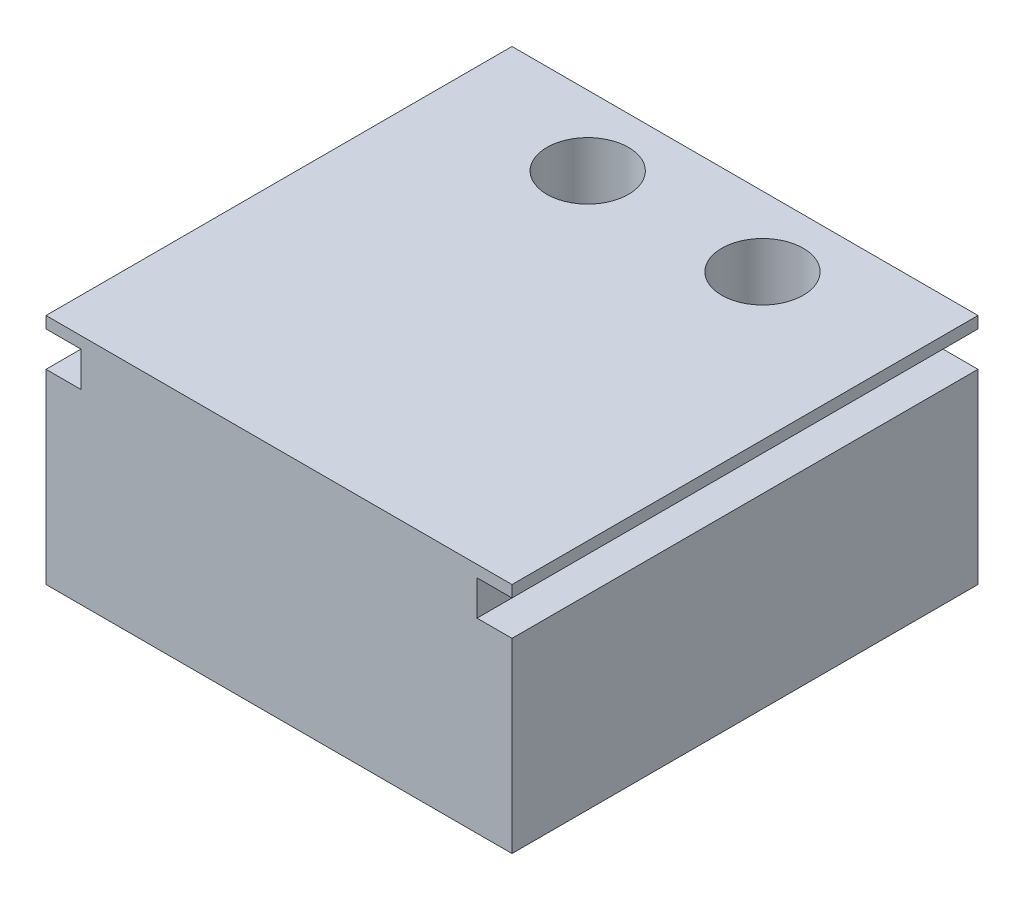
ISO-10303-21;
HEADER;
FILE_DESCRIPTION(('STEP AP214'),'2;1');
FILE_NAME('part.step','',(''),(''),'','','');
FILE_SCHEMA(('AUTOMOTIVE_DESIGN { 1 0 10303 214 1 1 1 1 }'));
ENDSEC;
DATA;
#1=APPLICATION_CONTEXT('core data for automotive mechanical design processes');
#2=APPLICATION_PROTOCOL_DEFINITION('international standard','automotive_design',2000,#1);
#3=PRODUCT_CONTEXT('',#1,'mechanical');
#4=PRODUCT('Part','Part','',(#3));
#5=PRODUCT_RELATED_PRODUCT_CATEGORY('part','',(#4));
#6=PRODUCT_DEFINITION_FORMATION('','',#4);
#7=PRODUCT_DEFINITION_CONTEXT('part definition',#1,'design');
#8=PRODUCT_DEFINITION('design','',#6,#7);
#9=PRODUCT_DEFINITION_SHAPE('','',#8);
#10=(LENGTH_UNIT() NAMED_UNIT(*) SI_UNIT(.MILLI.,.METRE.));
#11=(NAMED_UNIT(*) PLANE_ANGLE_UNIT() SI_UNIT($,.RADIAN.));
#12=(NAMED_UNIT(*) SI_UNIT($,.STERADIAN.) SOLID_ANGLE_UNIT());
#13=UNCERTAINTY_MEASURE_WITH_UNIT(LENGTH_MEASURE(1.E-05),#10,'distance_accuracy_value','');
#14=(GEOMETRIC_REPRESENTATION_CONTEXT(3) GLOBAL_UNCERTAINTY_ASSIGNED_CONTEXT((#13)) GLOBAL_UNIT_ASSIGNED_CONTEXT((#10,
#11,#12)) REPRESENTATION_CONTEXT('',''));
#15=CARTESIAN_POINT('',(0.,0.,0.));
#16=DIRECTION('',(0.,0.,1.));
#17=DIRECTION('',(1.,0.,0.));
#18=AXIS2_PLACEMENT_3D('',#15,#16,#17);
#19=CARTESIAN_POINT('',(-25.8539979689464,20.,-31.5087588131013));
#20=DIRECTION('',(0.,0.,1.));
#21=DIRECTION('',(1.,0.,0.));
#22=AXIS2_PLACEMENT_3D('',#19,#20,#21);
#23=PLANE('',#22);
#24=DIRECTION('',(-1.,0.,0.));
#25=VECTOR('',#24,1.);
#26=CARTESIAN_POINT('',(-22.8539979689464,16.,-31.5087588131013));
#27=LINE('',#26,#25);
#28=CARTESIAN_POINT('',(-22.8539979689464,16.,-31.5087588131013));
#29=VERTEX_POINT('',#28);
#30=CARTESIAN_POINT('',(-25.8539979689464,16.,-31.5087588131013));
#31=VERTEX_POINT('',#30);
#32=EDGE_CURVE('E175',#29,#31,#27,.T.);
#33=ORIENTED_EDGE('',*,*,#32,.F.);
#34=DIRECTION('',(0.,1.,0.));
#35=VECTOR('',#34,1.);
#36=CARTESIAN_POINT('',(-22.8539979689464,19.,-31.5087588131013));
#37=LINE('',#36,#35);
#38=CARTESIAN_POINT('',(-22.8539979689464,19.,-31.5087588131013));
#39=VERTEX_POINT('',#38);
#40=EDGE_CURVE('E156',#29,#39,#37,.T.);
#41=ORIENTED_EDGE('',*,*,#40,.T.);
#42=DIRECTION('',(-1.,0.,0.));
#43=VECTOR('',#42,1.);
#44=CARTESIAN_POINT('',(-22.8539979689464,19.,-31.5087588131013));
#45=LINE('',#44,#43);
#46=CARTESIAN_POINT('',(-25.8539979689464,19.,-31.5087588131013));
#47=VERTEX_POINT('',#46);
#48=EDGE_CURVE('E151',#39,#47,#45,.T.);
#49=ORIENTED_EDGE('',*,*,#48,.T.);
#50=DIRECTION('',(0.,-1.,0.));
#51=VECTOR('',#50,1.);
#52=CARTESIAN_POINT('',(-25.8539979689464,20.,-31.5087588131013));
#53=LINE('',#52,#51);
#54=CARTESIAN_POINT('',(-25.8539979689464,20.,-31.5087588131013));
#55=VERTEX_POINT('',#54);
#56=EDGE_CURVE('E265',#55,#47,#53,.T.);
#57=ORIENTED_EDGE('',*,*,#56,.F.);
#58=DIRECTION('',(-1.,0.,0.));
#59=VECTOR('',#58,1.);
#60=CARTESIAN_POINT('',(-25.8539979689464,20.,-31.5087588131013));
#61=LINE('',#60,#59);
#62=CARTESIAN_POINT('',(14.1460020310536,20.,-31.5087588131013));
#63=VERTEX_POINT('',#62);
#64=EDGE_CURVE('E233',#63,#55,#61,.T.);
#65=ORIENTED_EDGE('',*,*,#64,.F.);
#66=DIRECTION('',(0.,-1.,0.));
#67=VECTOR('',#66,1.);
#68=CARTESIAN_POINT('',(14.1460020310536,20.,-31.5087588131013));
#69=LINE('',#68,#67);
#70=CARTESIAN_POINT('',(14.1460020310536,19.,-31.5087588131013));
#71=VERTEX_POINT('',#70);
#72=EDGE_CURVE('E13',#63,#71,#69,.T.);
#73=ORIENTED_EDGE('',*,*,#72,.T.);
#74=DIRECTION('',(1.,0.,0.));
#75=VECTOR('',#74,1.);
#76=CARTESIAN_POINT('',(11.1460020310536,19.,-31.5087588131013));
#77=LINE('',#76,#75);
#78=CARTESIAN_POINT('',(11.1460020310536,19.,-31.5087588131013));
#79=VERTEX_POINT('',#78);
#80=EDGE_CURVE('E204',#79,#71,#77,.T.);
#81=ORIENTED_EDGE('',*,*,#80,.F.);
#82=DIRECTION('',(0.,1.,0.));
#83=VECTOR('',#82,1.);
#84=CARTESIAN_POINT('',(11.1460020310536,19.,-31.5087588131013));
#85=LINE('',#84,#83);
#86=CARTESIAN_POINT('',(11.1460020310536,16.,-31.5087588131013));
#87=VERTEX_POINT('',#86);
#88=EDGE_CURVE('E188',#87,#79,#85,.T.);
#89=ORIENTED_EDGE('',*,*,#88,.F.);
#90=DIRECTION('',(1.,0.,0.));
#91=VECTOR('',#90,1.);
#92=CARTESIAN_POINT('',(11.1460020310536,16.,-31.5087588131013));
#93=LINE('',#92,#91);
#94=CARTESIAN_POINT('',(14.1460020310536,16.,-31.5087588131013));
#95=VERTEX_POINT('',#94);
#96=EDGE_CURVE('E207',#87,#95,#93,.T.);
#97=ORIENTED_EDGE('',*,*,#96,.T.);
#98=CARTESIAN_POINT('',(14.1460020310536,0.,-31.5087588131013));
#99=VERTEX_POINT('',#98);
#100=EDGE_CURVE('E63',#95,#99,#69,.T.);
#101=ORIENTED_EDGE('',*,*,#100,.T.);
#102=DIRECTION('',(-1.,0.,0.));
#103=VECTOR('',#102,1.);
#104=CARTESIAN_POINT('',(-25.8539979689464,0.,-31.5087588131013));
#105=LINE('',#104,#103);
#106=CARTESIAN_POINT('',(-25.8539979689464,0.,-31.5087588131013));
#107=VERTEX_POINT('',#106);
#108=EDGE_CURVE('E247',#99,#107,#105,.T.);
#109=ORIENTED_EDGE('',*,*,#108,.T.);
#110=EDGE_CURVE('E264',#31,#107,#53,.T.);
#111=ORIENTED_EDGE('',*,*,#110,.F.);
#112=EDGE_LOOP('',(#33,#41,#49,#57,#65,#73,#81,#89,#97,#101,#109,#111));
#113=FACE_BOUND('',#112,.T.);
#114=ADVANCED_FACE('F54',(#113),#23,.F.);
#115=CARTESIAN_POINT('',(-25.8539979689464,20.,8.49124118689873));
#116=DIRECTION('',(1.,0.,0.));
#117=DIRECTION('',(0.,0.,-1.));
#118=AXIS2_PLACEMENT_3D('',#115,#116,#117);
#119=PLANE('',#118);
#120=DIRECTION('',(0.,0.,-1.));
#121=VECTOR('',#120,1.);
#122=CARTESIAN_POINT('',(-25.8539979689464,16.,8.49124118689873));
#123=LINE('',#122,#121);
#124=CARTESIAN_POINT('',(-25.8539979689464,16.,8.49124118689873));
#125=VERTEX_POINT('',#124);
#126=EDGE_CURVE('E164',#125,#31,#123,.T.);
#127=ORIENTED_EDGE('',*,*,#126,.T.);
#128=ORIENTED_EDGE('',*,*,#110,.T.);
#129=DIRECTION('',(0.,0.,1.));
#130=VECTOR('',#129,1.);
#131=CARTESIAN_POINT('',(-25.8539979689464,0.,8.49124118689873));
#132=LINE('',#131,#130);
#133=CARTESIAN_POINT('',(-25.8539979689464,0.,8.49124118689873));
#134=VERTEX_POINT('',#133);
#135=EDGE_CURVE('E251',#107,#134,#132,.T.);
#136=ORIENTED_EDGE('',*,*,#135,.T.);
#137=DIRECTION('',(0.,-1.,0.));
#138=VECTOR('',#137,1.);
#139=CARTESIAN_POINT('',(-25.8539979689464,20.,8.49124118689873));
#140=LINE('',#139,#138);
#141=EDGE_CURVE('E262',#125,#134,#140,.T.);
#142=ORIENTED_EDGE('',*,*,#141,.F.);
#143=EDGE_LOOP('',(#127,#128,#136,#142));
#144=FACE_BOUND('',#143,.T.);
#145=ADVANCED_FACE('F276',(#144),#119,.F.);
#146=DIRECTION('',(0.,0.,1.));
#147=VECTOR('',#146,1.);
#148=CARTESIAN_POINT('',(-25.8539979689464,19.,8.49124118689873));
#149=LINE('',#148,#147);
#150=CARTESIAN_POINT('',(-25.8539979689464,19.,8.49124118689873));
#151=VERTEX_POINT('',#150);
#152=EDGE_CURVE('E297',#47,#151,#149,.T.);
#153=ORIENTED_EDGE('',*,*,#152,.T.);
#154=CARTESIAN_POINT('',(-25.8539979689464,20.,8.49124118689873));
#155=VERTEX_POINT('',#154);
#156=EDGE_CURVE('E170',#155,#151,#140,.T.);
#157=ORIENTED_EDGE('',*,*,#156,.F.);
#158=DIRECTION('',(0.,0.,1.));
#159=VECTOR('',#158,1.);
#160=CARTESIAN_POINT('',(-25.8539979689464,20.,8.49124118689873));
#161=LINE('',#160,#159);
#162=EDGE_CURVE('E237',#55,#155,#161,.T.);
#163=ORIENTED_EDGE('',*,*,#162,.F.);
#164=ORIENTED_EDGE('',*,*,#56,.T.);
#165=EDGE_LOOP('',(#153,#157,#163,#164));
#166=FACE_BOUND('',#165,.T.);
#167=ADVANCED_FACE('F301',(#166),#119,.F.);
#168=CARTESIAN_POINT('',(14.1460020310536,20.,8.49124118689873));
#169=DIRECTION('',(0.,0.,-1.));
#170=DIRECTION('',(-1.,0.,0.));
#171=AXIS2_PLACEMENT_3D('',#168,#169,#170);
#172=PLANE('',#171);
#173=DIRECTION('',(-1.,0.,0.));
#174=VECTOR('',#173,1.);
#175=CARTESIAN_POINT('',(-22.8539979689464,16.,8.49124118689873));
#176=LINE('',#175,#174);
#177=CARTESIAN_POINT('',(-22.8539979689464,16.,8.49124118689873));
#178=VERTEX_POINT('',#177);
#179=EDGE_CURVE('E70',#178,#125,#176,.T.);
#180=ORIENTED_EDGE('',*,*,#179,.T.);
#181=ORIENTED_EDGE('',*,*,#141,.T.);
#182=DIRECTION('',(1.,0.,0.));
#183=VECTOR('',#182,1.);
#184=CARTESIAN_POINT('',(14.1460020310536,0.,8.49124118689873));
#185=LINE('',#184,#183);
#186=CARTESIAN_POINT('',(14.1460020310536,0.,8.49124118689873));
#187=VERTEX_POINT('',#186);
#188=EDGE_CURVE('E234',#134,#187,#185,.T.);
#189=ORIENTED_EDGE('',*,*,#188,.T.);
#190=DIRECTION('',(0.,-1.,0.));
#191=VECTOR('',#190,1.);
#192=CARTESIAN_POINT('',(14.1460020310536,20.,8.49124118689873));
#193=LINE('',#192,#191);
#194=CARTESIAN_POINT('',(14.1460020310536,16.,8.49124118689873));
#195=VERTEX_POINT('',#194);
#196=EDGE_CURVE('E243',#195,#187,#193,.T.);
#197=ORIENTED_EDGE('',*,*,#196,.F.);
#198=DIRECTION('',(1.,0.,0.));
#199=VECTOR('',#198,1.);
#200=CARTESIAN_POINT('',(11.1460020310536,16.,8.49124118689873));
#201=LINE('',#200,#199);
#202=CARTESIAN_POINT('',(11.1460020310536,16.,8.49124118689873));
#203=VERTEX_POINT('',#202);
#204=EDGE_CURVE('E193',#203,#195,#201,.T.);
#205=ORIENTED_EDGE('',*,*,#204,.F.);
#206=DIRECTION('',(0.,-1.,0.));
#207=VECTOR('',#206,1.);
#208=CARTESIAN_POINT('',(11.1460020310536,19.,8.49124118689873));
#209=LINE('',#208,#207);
#210=CARTESIAN_POINT('',(11.1460020310536,19.,8.49124118689873));
#211=VERTEX_POINT('',#210);
#212=EDGE_CURVE('E180',#211,#203,#209,.T.);
#213=ORIENTED_EDGE('',*,*,#212,.F.);
#214=DIRECTION('',(1.,0.,0.));
#215=VECTOR('',#214,1.);
#216=CARTESIAN_POINT('',(11.1460020310536,19.,8.49124118689873));
#217=LINE('',#216,#215);
#218=CARTESIAN_POINT('',(14.1460020310536,19.,8.49124118689873));
#219=VERTEX_POINT('',#218);
#220=EDGE_CURVE('E199',#211,#219,#217,.T.);
#221=ORIENTED_EDGE('',*,*,#220,.T.);
#222=CARTESIAN_POINT('',(14.1460020310536,20.,8.49124118689873));
#223=VERTEX_POINT('',#222);
#224=EDGE_CURVE('E258',#223,#219,#193,.T.);
#225=ORIENTED_EDGE('',*,*,#224,.F.);
#226=DIRECTION('',(1.,0.,0.));
#227=VECTOR('',#226,1.);
#228=CARTESIAN_POINT('',(14.1460020310536,20.,8.49124118689873));
#229=LINE('',#228,#227);
#230=EDGE_CURVE('E240',#155,#223,#229,.T.);
#231=ORIENTED_EDGE('',*,*,#230,.F.);
#232=ORIENTED_EDGE('',*,*,#156,.T.);
#233=DIRECTION('',(-1.,0.,0.));
#234=VECTOR('',#233,1.);
#235=CARTESIAN_POINT('',(-22.8539979689464,19.,8.49124118689873));
#236=LINE('',#235,#234);
#237=CARTESIAN_POINT('',(-22.8539979689464,19.,8.49124118689873));
#238=VERTEX_POINT('',#237);
#239=EDGE_CURVE('E148',#238,#151,#236,.T.);
#240=ORIENTED_EDGE('',*,*,#239,.F.);
#241=DIRECTION('',(0.,-1.,0.));
#242=VECTOR('',#241,1.);
#243=CARTESIAN_POINT('',(-22.8539979689464,19.,8.49124118689873));
#244=LINE('',#243,#242);
#245=EDGE_CURVE('E157',#238,#178,#244,.T.);
#246=ORIENTED_EDGE('',*,*,#245,.T.);
#247=EDGE_LOOP('',(#180,#181,#189,#197,#205,#213,#221,#225,#231,#232,#240,#246));
#248=FACE_BOUND('',#247,.T.);
#249=ADVANCED_FACE('F167',(#248),#172,.F.);
#250=CARTESIAN_POINT('',(14.1460020310536,20.,-31.5087588131013));
#251=DIRECTION('',(-1.,0.,0.));
#252=DIRECTION('',(0.,0.,1.));
#253=AXIS2_PLACEMENT_3D('',#250,#251,#252);
#254=PLANE('',#253);
#255=ORIENTED_EDGE('',*,*,#224,.T.);
#256=DIRECTION('',(0.,0.,1.));
#257=VECTOR('',#256,1.);
#258=CARTESIAN_POINT('',(14.1460020310536,19.,8.49124118689873));
#259=LINE('',#258,#257);
#260=EDGE_CURVE('E184',#71,#219,#259,.T.);
#261=ORIENTED_EDGE('',*,*,#260,.F.);
#262=ORIENTED_EDGE('',*,*,#72,.F.);
#263=DIRECTION('',(0.,0.,-1.));
#264=VECTOR('',#263,1.);
#265=CARTESIAN_POINT('',(14.1460020310536,20.,-31.5087588131013));
#266=LINE('',#265,#264);
#267=EDGE_CURVE('E229',#223,#63,#266,.T.);
#268=ORIENTED_EDGE('',*,*,#267,.F.);
#269=EDGE_LOOP('',(#255,#261,#262,#268));
#270=FACE_BOUND('',#269,.T.);
#271=ADVANCED_FACE('F309',(#270),#254,.F.);
#272=ORIENTED_EDGE('',*,*,#100,.F.);
#273=DIRECTION('',(0.,0.,-1.));
#274=VECTOR('',#273,1.);
#275=CARTESIAN_POINT('',(14.1460020310536,16.,8.49124118689873));
#276=LINE('',#275,#274);
#277=EDGE_CURVE('E194',#195,#95,#276,.T.);
#278=ORIENTED_EDGE('',*,*,#277,.F.);
#279=ORIENTED_EDGE('',*,*,#196,.T.);
#280=DIRECTION('',(0.,0.,-1.));
#281=VECTOR('',#280,1.);
#282=CARTESIAN_POINT('',(14.1460020310536,0.,-31.5087588131013));
#283=LINE('',#282,#281);
#284=EDGE_CURVE('E217',#187,#99,#283,.T.);
#285=ORIENTED_EDGE('',*,*,#284,.T.);
#286=EDGE_LOOP('',(#272,#278,#279,#285));
#287=FACE_BOUND('',#286,.T.);
#288=ADVANCED_FACE('F56',(#287),#254,.F.);
#289=CARTESIAN_POINT('',(0.,20.,0.));
#290=DIRECTION('',(0.,-1.,0.));
#291=DIRECTION('',(0.,0.,-1.));
#292=AXIS2_PLACEMENT_3D('',#289,#290,#291);
#293=PLANE('',#292);
#294=CARTESIAN_POINT('',(-13.3539979689464,20.,-25.5087588131013));
#295=DIRECTION('',(0.,1.,0.));
#296=DIRECTION('',(0.,0.,1.));
#297=AXIS2_PLACEMENT_3D('',#294,#295,#296);
#298=CIRCLE('',#297,3.5);
#299=CARTESIAN_POINT('',(-13.3539979689464,20.,-22.0087588131013));
#300=VERTEX_POINT('',#299);
#301=EDGE_CURVE('E218',#300,#300,#298,.T.);
#302=ORIENTED_EDGE('',*,*,#301,.F.);
#303=EDGE_LOOP('',(#302));
#304=FACE_BOUND('',#303,.T.);
#305=CARTESIAN_POINT('',(1.64600203105357,20.,-25.5087588131013));
#306=DIRECTION('',(0.,1.,0.));
#307=DIRECTION('',(0.,0.,1.));
#308=AXIS2_PLACEMENT_3D('',#305,#306,#307);
#309=CIRCLE('',#308,3.5);
#310=CARTESIAN_POINT('',(1.64600203105357,20.,-22.0087588131013));
#311=VERTEX_POINT('',#310);
#312=EDGE_CURVE('E222',#311,#311,#309,.T.);
#313=ORIENTED_EDGE('',*,*,#312,.F.);
#314=EDGE_LOOP('',(#313));
#315=FACE_BOUND('',#314,.T.);
#316=ORIENTED_EDGE('',*,*,#267,.T.);
#317=ORIENTED_EDGE('',*,*,#64,.T.);
#318=ORIENTED_EDGE('',*,*,#162,.T.);
#319=ORIENTED_EDGE('',*,*,#230,.T.);
#320=EDGE_LOOP('',(#316,#317,#318,#319));
#321=FACE_BOUND('',#320,.T.);
#322=ADVANCED_FACE('F303',(#304,#315,#321),#293,.F.);
#323=CARTESIAN_POINT('',(0.,0.,0.));
#324=DIRECTION('',(0.,-1.,0.));
#325=DIRECTION('',(0.,0.,-1.));
#326=AXIS2_PLACEMENT_3D('',#323,#324,#325);
#327=PLANE('',#326);
#328=ORIENTED_EDGE('',*,*,#284,.F.);
#329=ORIENTED_EDGE('',*,*,#188,.F.);
#330=ORIENTED_EDGE('',*,*,#135,.F.);
#331=ORIENTED_EDGE('',*,*,#108,.F.);
#332=EDGE_LOOP('',(#328,#329,#330,#331));
#333=FACE_BOUND('',#332,.T.);
#334=ADVANCED_FACE('F286',(#333),#327,.T.);
#335=CARTESIAN_POINT('',(1.64600203105357,5.,-25.5087588131013));
#336=DIRECTION('',(0.,1.,0.));
#337=DIRECTION('',(0.,0.,1.));
#338=AXIS2_PLACEMENT_3D('',#335,#336,#337);
#339=CYLINDRICAL_SURFACE('',#338,3.5);
#340=CARTESIAN_POINT('',(1.64600203105357,5.,-25.5087588131013));
#341=DIRECTION('',(0.,1.,0.));
#342=DIRECTION('',(0.,0.,1.));
#343=AXIS2_PLACEMENT_3D('',#340,#341,#342);
#344=CIRCLE('',#343,3.5);
#345=CARTESIAN_POINT('',(1.64600203105357,5.,-22.0087588131013));
#346=VERTEX_POINT('',#345);
#347=EDGE_CURVE('E203',#346,#346,#344,.T.);
#348=ORIENTED_EDGE('',*,*,#347,.F.);
#349=EDGE_LOOP('',(#348));
#350=FACE_BOUND('',#349,.T.);
#351=ORIENTED_EDGE('',*,*,#312,.T.);
#352=EDGE_LOOP('',(#351));
#353=FACE_BOUND('',#352,.T.);
#354=ADVANCED_FACE('F336',(#350,#353),#339,.F.);
#355=CARTESIAN_POINT('',(1.64600203105357,5.,-25.5087588131013));
#356=DIRECTION('',(0.,1.,0.));
#357=DIRECTION('',(0.,0.,1.));
#358=AXIS2_PLACEMENT_3D('',#355,#356,#357);
#359=PLANE('',#358);
#360=ORIENTED_EDGE('',*,*,#347,.T.);
#361=EDGE_LOOP('',(#360));
#362=FACE_BOUND('',#361,.T.);
#363=ADVANCED_FACE('F338',(#362),#359,.T.);
#364=CARTESIAN_POINT('',(-13.3539979689464,5.,-25.5087588131013));
#365=DIRECTION('',(0.,1.,0.));
#366=DIRECTION('',(0.,0.,1.));
#367=AXIS2_PLACEMENT_3D('',#364,#365,#366);
#368=CYLINDRICAL_SURFACE('',#367,3.5);
#369=CARTESIAN_POINT('',(-13.3539979689464,5.,-25.5087588131013));
#370=DIRECTION('',(0.,1.,0.));
#371=DIRECTION('',(0.,0.,1.));
#372=AXIS2_PLACEMENT_3D('',#369,#370,#371);
#373=CIRCLE('',#372,3.5);
#374=CARTESIAN_POINT('',(-13.3539979689464,5.,-22.0087588131013));
#375=VERTEX_POINT('',#374);
#376=EDGE_CURVE('E213',#375,#375,#373,.T.);
#377=ORIENTED_EDGE('',*,*,#376,.F.);
#378=EDGE_LOOP('',(#377));
#379=FACE_BOUND('',#378,.T.);
#380=ORIENTED_EDGE('',*,*,#301,.T.);
#381=EDGE_LOOP('',(#380));
#382=FACE_BOUND('',#381,.T.);
#383=ADVANCED_FACE('F341',(#379,#382),#368,.F.);
#384=CARTESIAN_POINT('',(-13.3539979689464,5.,-25.5087588131013));
#385=DIRECTION('',(0.,1.,0.));
#386=DIRECTION('',(0.,0.,1.));
#387=AXIS2_PLACEMENT_3D('',#384,#385,#386);
#388=PLANE('',#387);
#389=ORIENTED_EDGE('',*,*,#376,.T.);
#390=EDGE_LOOP('',(#389));
#391=FACE_BOUND('',#390,.T.);
#392=ADVANCED_FACE('F348',(#391),#388,.T.);
#393=CARTESIAN_POINT('',(11.1460020310536,19.,8.49124118689873));
#394=DIRECTION('',(0.,1.,0.));
#395=DIRECTION('',(0.,0.,1.));
#396=AXIS2_PLACEMENT_3D('',#393,#394,#395);
#397=PLANE('',#396);
#398=ORIENTED_EDGE('',*,*,#260,.T.);
#399=ORIENTED_EDGE('',*,*,#220,.F.);
#400=DIRECTION('',(0.,0.,1.));
#401=VECTOR('',#400,1.);
#402=CARTESIAN_POINT('',(11.1460020310536,19.,8.49124118689873));
#403=LINE('',#402,#401);
#404=EDGE_CURVE('E78',#79,#211,#403,.T.);
#405=ORIENTED_EDGE('',*,*,#404,.F.);
#406=ORIENTED_EDGE('',*,*,#80,.T.);
#407=EDGE_LOOP('',(#398,#399,#405,#406));
#408=FACE_BOUND('',#407,.T.);
#409=ADVANCED_FACE('F313',(#408),#397,.F.);
#410=CARTESIAN_POINT('',(11.1460020310536,16.,8.49124118689873));
#411=DIRECTION('',(0.,-1.,0.));
#412=DIRECTION('',(0.,0.,-1.));
#413=AXIS2_PLACEMENT_3D('',#410,#411,#412);
#414=PLANE('',#413);
#415=ORIENTED_EDGE('',*,*,#277,.T.);
#416=ORIENTED_EDGE('',*,*,#96,.F.);
#417=DIRECTION('',(0.,0.,-1.));
#418=VECTOR('',#417,1.);
#419=CARTESIAN_POINT('',(11.1460020310536,16.,8.49124118689873));
#420=LINE('',#419,#418);
#421=EDGE_CURVE('E183',#203,#87,#420,.T.);
#422=ORIENTED_EDGE('',*,*,#421,.F.);
#423=ORIENTED_EDGE('',*,*,#204,.T.);
#424=EDGE_LOOP('',(#415,#416,#422,#423));
#425=FACE_BOUND('',#424,.T.);
#426=ADVANCED_FACE('F317',(#425),#414,.F.);
#427=CARTESIAN_POINT('',(11.1460020310536,0.,0.));
#428=DIRECTION('',(1.,0.,0.));
#429=DIRECTION('',(0.,0.,-1.));
#430=AXIS2_PLACEMENT_3D('',#427,#428,#429);
#431=PLANE('',#430);
#432=ORIENTED_EDGE('',*,*,#212,.T.);
#433=ORIENTED_EDGE('',*,*,#421,.T.);
#434=ORIENTED_EDGE('',*,*,#88,.T.);
#435=ORIENTED_EDGE('',*,*,#404,.T.);
#436=EDGE_LOOP('',(#432,#433,#434,#435));
#437=FACE_BOUND('',#436,.T.);
#438=ADVANCED_FACE('F315',(#437),#431,.T.);
#439=CARTESIAN_POINT('',(-22.8539979689464,16.,8.49124118689873));
#440=DIRECTION('',(0.,1.,0.));
#441=DIRECTION('',(0.,0.,1.));
#442=AXIS2_PLACEMENT_3D('',#439,#440,#441);
#443=PLANE('',#442);
#444=ORIENTED_EDGE('',*,*,#126,.F.);
#445=ORIENTED_EDGE('',*,*,#179,.F.);
#446=DIRECTION('',(0.,0.,-1.));
#447=VECTOR('',#446,1.);
#448=CARTESIAN_POINT('',(-22.8539979689464,16.,8.49124118689873));
#449=LINE('',#448,#447);
#450=EDGE_CURVE('E161',#178,#29,#449,.T.);
#451=ORIENTED_EDGE('',*,*,#450,.T.);
#452=ORIENTED_EDGE('',*,*,#32,.T.);
#453=EDGE_LOOP('',(#444,#445,#451,#452));
#454=FACE_BOUND('',#453,.T.);
#455=ADVANCED_FACE('F359',(#454),#443,.T.);
#456=CARTESIAN_POINT('',(-22.8539979689464,19.,8.49124118689873));
#457=DIRECTION('',(0.,-1.,0.));
#458=DIRECTION('',(0.,0.,-1.));
#459=AXIS2_PLACEMENT_3D('',#456,#457,#458);
#460=PLANE('',#459);
#461=ORIENTED_EDGE('',*,*,#152,.F.);
#462=ORIENTED_EDGE('',*,*,#48,.F.);
#463=DIRECTION('',(0.,0.,1.));
#464=VECTOR('',#463,1.);
#465=CARTESIAN_POINT('',(-22.8539979689464,19.,8.49124118689873));
#466=LINE('',#465,#464);
#467=EDGE_CURVE('E144',#39,#238,#466,.T.);
#468=ORIENTED_EDGE('',*,*,#467,.T.);
#469=ORIENTED_EDGE('',*,*,#239,.T.);
#470=EDGE_LOOP('',(#461,#462,#468,#469));
#471=FACE_BOUND('',#470,.T.);
#472=ADVANCED_FACE('F146',(#471),#460,.T.);
#473=CARTESIAN_POINT('',(-22.8539979689464,0.,0.));
#474=DIRECTION('',(-1.,0.,0.));
#475=DIRECTION('',(0.,0.,-1.));
#476=AXIS2_PLACEMENT_3D('',#473,#474,#475);
#477=PLANE('',#476);
#478=ORIENTED_EDGE('',*,*,#245,.F.);
#479=ORIENTED_EDGE('',*,*,#467,.F.);
#480=ORIENTED_EDGE('',*,*,#40,.F.);
#481=ORIENTED_EDGE('',*,*,#450,.F.);
#482=EDGE_LOOP('',(#478,#479,#480,#481));
#483=FACE_BOUND('',#482,.T.);
#484=ADVANCED_FACE('F160',(#483),#477,.T.);
#485=CLOSED_SHELL('',(#114,#145,#167,#249,#271,#288,#322,#334,#354,#363,#383,#392,#409,#426,
#438,#455,#472,#484));
#486=MANIFOLD_SOLID_BREP('B2',#485);
#487=ADVANCED_BREP_SHAPE_REPRESENTATION('',(#18,#486),#14);
#488=SHAPE_DEFINITION_REPRESENTATION(#9,#487);
ENDSEC;
END-ISO-10303-21;
